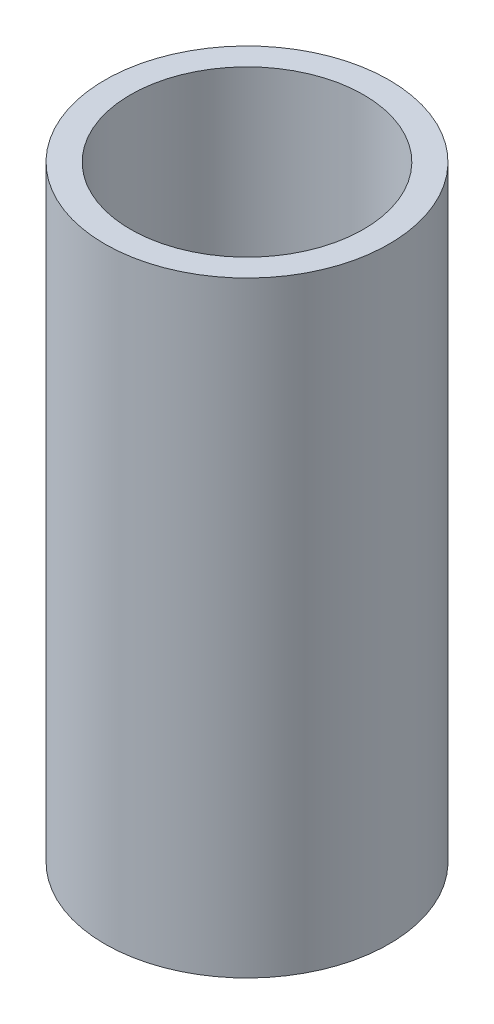
ISO-10303-21;
HEADER;
FILE_DESCRIPTION(('STEP AP214'),'2;1');
FILE_NAME('part.step','',(''),(''),'','','');
FILE_SCHEMA(('AUTOMOTIVE_DESIGN { 1 0 10303 214 1 1 1 1 }'));
ENDSEC;
DATA;
#1=APPLICATION_CONTEXT('core data for automotive mechanical design processes');
#2=APPLICATION_PROTOCOL_DEFINITION('international standard','automotive_design',2000,#1);
#3=PRODUCT_CONTEXT('',#1,'mechanical');
#4=PRODUCT('Part','Part','',(#3));
#5=PRODUCT_RELATED_PRODUCT_CATEGORY('part','',(#4));
#6=PRODUCT_DEFINITION_FORMATION('','',#4);
#7=PRODUCT_DEFINITION_CONTEXT('part definition',#1,'design');
#8=PRODUCT_DEFINITION('design','',#6,#7);
#9=PRODUCT_DEFINITION_SHAPE('','',#8);
#10=(LENGTH_UNIT() NAMED_UNIT(*) SI_UNIT(.MILLI.,.METRE.));
#11=(NAMED_UNIT(*) PLANE_ANGLE_UNIT() SI_UNIT($,.RADIAN.));
#12=(NAMED_UNIT(*) SI_UNIT($,.STERADIAN.) SOLID_ANGLE_UNIT());
#13=UNCERTAINTY_MEASURE_WITH_UNIT(LENGTH_MEASURE(1.E-05),#10,'distance_accuracy_value','');
#14=(GEOMETRIC_REPRESENTATION_CONTEXT(3) GLOBAL_UNCERTAINTY_ASSIGNED_CONTEXT((#13)) GLOBAL_UNIT_ASSIGNED_CONTEXT((#10,
#11,#12)) REPRESENTATION_CONTEXT('',''));
#15=CARTESIAN_POINT('',(0.,0.,0.));
#16=DIRECTION('',(0.,0.,1.));
#17=DIRECTION('',(1.,0.,0.));
#18=AXIS2_PLACEMENT_3D('',#15,#16,#17);
#19=CARTESIAN_POINT('',(0.,6.5,0.));
#20=DIRECTION('',(0.,1.,0.));
#21=DIRECTION('',(0.,0.,1.));
#22=AXIS2_PLACEMENT_3D('',#19,#20,#21);
#23=PLANE('',#22);
#24=CARTESIAN_POINT('',(0.,6.5,0.));
#25=DIRECTION('',(0.,1.,0.));
#26=DIRECTION('',(0.,0.,1.));
#27=AXIS2_PLACEMENT_3D('',#24,#25,#26);
#28=CIRCLE('',#27,3.048);
#29=CARTESIAN_POINT('',(0.,6.5,-3.048));
#30=VERTEX_POINT('',#29);
#31=EDGE_CURVE('E10',#30,#30,#28,.T.);
#32=ORIENTED_EDGE('',*,*,#31,.T.);
#33=EDGE_LOOP('',(#32));
#34=FACE_BOUND('',#33,.T.);
#35=CARTESIAN_POINT('',(0.,6.5,0.));
#36=DIRECTION('',(0.,1.,0.));
#37=DIRECTION('',(0.,0.,1.));
#38=AXIS2_PLACEMENT_3D('',#35,#36,#37);
#39=CIRCLE('',#38,2.5);
#40=CARTESIAN_POINT('',(0.,6.5,-2.5));
#41=VERTEX_POINT('',#40);
#42=EDGE_CURVE('E46',#41,#41,#39,.T.);
#43=ORIENTED_EDGE('',*,*,#42,.F.);
#44=EDGE_LOOP('',(#43));
#45=FACE_BOUND('',#44,.T.);
#46=ADVANCED_FACE('F35',(#34,#45),#23,.T.);
#47=CARTESIAN_POINT('',(0.,-6.5,0.));
#48=DIRECTION('',(0.,1.,0.));
#49=DIRECTION('',(0.,0.,1.));
#50=AXIS2_PLACEMENT_3D('',#47,#48,#49);
#51=PLANE('',#50);
#52=CARTESIAN_POINT('',(0.,-6.5,0.));
#53=DIRECTION('',(0.,1.,0.));
#54=DIRECTION('',(0.,0.,1.));
#55=AXIS2_PLACEMENT_3D('',#52,#53,#54);
#56=CIRCLE('',#55,3.048);
#57=CARTESIAN_POINT('',(0.,-6.5,-3.048));
#58=VERTEX_POINT('',#57);
#59=EDGE_CURVE('E39',#58,#58,#56,.T.);
#60=ORIENTED_EDGE('',*,*,#59,.F.);
#61=EDGE_LOOP('',(#60));
#62=FACE_BOUND('',#61,.T.);
#63=CARTESIAN_POINT('',(0.,-6.5,0.));
#64=DIRECTION('',(0.,1.,0.));
#65=DIRECTION('',(0.,0.,1.));
#66=AXIS2_PLACEMENT_3D('',#63,#64,#65);
#67=CIRCLE('',#66,2.5);
#68=CARTESIAN_POINT('',(0.,-6.5,-2.5));
#69=VERTEX_POINT('',#68);
#70=EDGE_CURVE('E48',#69,#69,#67,.T.);
#71=ORIENTED_EDGE('',*,*,#70,.T.);
#72=EDGE_LOOP('',(#71));
#73=FACE_BOUND('',#72,.T.);
#74=ADVANCED_FACE('F58',(#62,#73),#51,.F.);
#75=CARTESIAN_POINT('',(0.,6.5,0.));
#76=DIRECTION('',(0.,-1.,0.));
#77=DIRECTION('',(0.,0.,-1.));
#78=AXIS2_PLACEMENT_3D('',#75,#76,#77);
#79=CYLINDRICAL_SURFACE('',#78,3.048);
#80=CARTESIAN_POINT('',(0.,6.5,-3.048));
#81=CARTESIAN_POINT('',(0.,6.36458333333333,-3.048));
#82=CARTESIAN_POINT('',(0.,6.22916666666667,-3.048));
#83=CARTESIAN_POINT('',(0.,5.95833333333333,-3.048));
#84=CARTESIAN_POINT('',(0.,5.82291666666667,-3.048));
#85=CARTESIAN_POINT('',(0.,5.55208333333333,-3.048));
#86=CARTESIAN_POINT('',(0.,5.41666666666667,-3.048));
#87=CARTESIAN_POINT('',(0.,5.14583333333333,-3.048));
#88=CARTESIAN_POINT('',(0.,5.01041666666667,-3.048));
#89=CARTESIAN_POINT('',(0.,4.73958333333333,-3.048));
#90=CARTESIAN_POINT('',(0.,4.60416666666667,-3.048));
#91=CARTESIAN_POINT('',(0.,4.33333333333333,-3.048));
#92=CARTESIAN_POINT('',(0.,4.19791666666667,-3.048));
#93=CARTESIAN_POINT('',(0.,3.92708333333333,-3.048));
#94=CARTESIAN_POINT('',(0.,3.79166666666667,-3.048));
#95=CARTESIAN_POINT('',(0.,3.52083333333333,-3.048));
#96=CARTESIAN_POINT('',(0.,3.38541666666667,-3.048));
#97=CARTESIAN_POINT('',(0.,3.11458333333333,-3.048));
#98=CARTESIAN_POINT('',(0.,2.97916666666667,-3.048));
#99=CARTESIAN_POINT('',(0.,2.70833333333333,-3.048));
#100=CARTESIAN_POINT('',(0.,2.57291666666667,-3.048));
#101=CARTESIAN_POINT('',(0.,2.30208333333333,-3.048));
#102=CARTESIAN_POINT('',(0.,2.16666666666667,-3.048));
#103=CARTESIAN_POINT('',(0.,1.89583333333333,-3.048));
#104=CARTESIAN_POINT('',(0.,1.76041666666667,-3.048));
#105=CARTESIAN_POINT('',(0.,1.48958333333333,-3.048));
#106=CARTESIAN_POINT('',(0.,1.35416666666667,-3.048));
#107=CARTESIAN_POINT('',(0.,1.08333333333333,-3.048));
#108=CARTESIAN_POINT('',(0.,0.947916666666667,-3.048));
#109=CARTESIAN_POINT('',(0.,0.677083333333333,-3.048));
#110=CARTESIAN_POINT('',(0.,0.541666666666667,-3.048));
#111=CARTESIAN_POINT('',(0.,0.270833333333334,-3.048));
#112=CARTESIAN_POINT('',(0.,0.135416666666667,-3.048));
#113=CARTESIAN_POINT('',(0.,-0.135416666666667,-3.048));
#114=CARTESIAN_POINT('',(0.,-0.270833333333334,-3.048));
#115=CARTESIAN_POINT('',(0.,-0.541666666666667,-3.048));
#116=CARTESIAN_POINT('',(0.,-0.677083333333333,-3.048));
#117=CARTESIAN_POINT('',(0.,-0.947916666666667,-3.048));
#118=CARTESIAN_POINT('',(0.,-1.08333333333333,-3.048));
#119=CARTESIAN_POINT('',(0.,-1.35416666666667,-3.048));
#120=CARTESIAN_POINT('',(0.,-1.48958333333333,-3.048));
#121=CARTESIAN_POINT('',(0.,-1.76041666666667,-3.048));
#122=CARTESIAN_POINT('',(0.,-1.89583333333333,-3.048));
#123=CARTESIAN_POINT('',(0.,-2.16666666666667,-3.048));
#124=CARTESIAN_POINT('',(0.,-2.30208333333333,-3.048));
#125=CARTESIAN_POINT('',(0.,-2.57291666666667,-3.048));
#126=CARTESIAN_POINT('',(0.,-2.70833333333333,-3.048));
#127=CARTESIAN_POINT('',(0.,-2.97916666666667,-3.048));
#128=CARTESIAN_POINT('',(0.,-3.11458333333333,-3.048));
#129=CARTESIAN_POINT('',(0.,-3.38541666666667,-3.048));
#130=CARTESIAN_POINT('',(0.,-3.52083333333333,-3.048));
#131=CARTESIAN_POINT('',(0.,-3.79166666666667,-3.048));
#132=CARTESIAN_POINT('',(0.,-3.92708333333333,-3.048));
#133=CARTESIAN_POINT('',(0.,-4.19791666666667,-3.048));
#134=CARTESIAN_POINT('',(0.,-4.33333333333333,-3.048));
#135=CARTESIAN_POINT('',(0.,-4.60416666666667,-3.048));
#136=CARTESIAN_POINT('',(0.,-4.73958333333333,-3.048));
#137=CARTESIAN_POINT('',(0.,-5.01041666666667,-3.048));
#138=CARTESIAN_POINT('',(0.,-5.14583333333333,-3.048));
#139=CARTESIAN_POINT('',(0.,-5.41666666666667,-3.048));
#140=CARTESIAN_POINT('',(0.,-5.55208333333333,-3.048));
#141=CARTESIAN_POINT('',(0.,-5.82291666666667,-3.048));
#142=CARTESIAN_POINT('',(0.,-5.95833333333333,-3.048));
#143=CARTESIAN_POINT('',(0.,-6.22916666666667,-3.048));
#144=CARTESIAN_POINT('',(0.,-6.36458333333333,-3.048));
#145=CARTESIAN_POINT('',(0.,-6.5,-3.048));
#146=B_SPLINE_CURVE_WITH_KNOTS('',3,(#80,#81,#82,#83,#84,#85,#86,#87,#88,#89,#90,#91,#92,#93,
#94,#95,#96,#97,#98,#99,#100,#101,#102,#103,#104,#105,#106,#107,#108,#109,#110,#111,#112,#113,
#114,#115,#116,#117,#118,#119,#120,#121,#122,#123,#124,#125,#126,#127,#128,#129,#130,#131,#132,
#133,#134,#135,#136,#137,#138,#139,#140,#141,#142,#143,#144,#145),.UNSPECIFIED.,.F.,.F.,(4,2,2,
2,2,2,2,2,2,2,2,2,2,2,2,2,2,2,2,2,2,2,2,2,2,2,2,2,2,2,2,2,4),(0.,0.40625,0.812500000000001,
1.21875,1.625,2.03125,2.4375,2.84375,3.25,3.65625,4.0625,4.46875,4.875,5.28125,5.6875,6.09375,
6.5,6.90625,7.3125,7.71875,8.125,8.53125,8.9375,9.34375,9.75,10.15625,10.5625,10.96875,11.375,
11.78125,12.1875,12.59375,13.),.UNSPECIFIED.);
#147=EDGE_CURVE('BSEAM37',#30,#58,#146,.T.);
#148=ORIENTED_EDGE('',*,*,#31,.F.);
#149=ORIENTED_EDGE('',*,*,#59,.T.);
#150=ORIENTED_EDGE('',*,*,#147,.T.);
#151=ORIENTED_EDGE('',*,*,#147,.F.);
#152=EDGE_LOOP('',(#148,#150,#149,#151));
#153=FACE_BOUND('',#152,.T.);
#154=ADVANCED_FACE('F37',(#153),#79,.T.);
#155=CARTESIAN_POINT('',(0.,6.5,0.));
#156=DIRECTION('',(0.,-1.,0.));
#157=DIRECTION('',(0.,0.,-1.));
#158=AXIS2_PLACEMENT_3D('',#155,#156,#157);
#159=CYLINDRICAL_SURFACE('',#158,2.5);
#160=CARTESIAN_POINT('',(0.,6.5,-2.5));
#161=CARTESIAN_POINT('',(0.,6.36458333333333,-2.5));
#162=CARTESIAN_POINT('',(0.,6.22916666666667,-2.5));
#163=CARTESIAN_POINT('',(0.,5.95833333333333,-2.5));
#164=CARTESIAN_POINT('',(0.,5.82291666666667,-2.5));
#165=CARTESIAN_POINT('',(0.,5.55208333333333,-2.5));
#166=CARTESIAN_POINT('',(0.,5.41666666666667,-2.5));
#167=CARTESIAN_POINT('',(0.,5.14583333333333,-2.5));
#168=CARTESIAN_POINT('',(0.,5.01041666666667,-2.5));
#169=CARTESIAN_POINT('',(0.,4.73958333333333,-2.5));
#170=CARTESIAN_POINT('',(0.,4.60416666666667,-2.5));
#171=CARTESIAN_POINT('',(0.,4.33333333333333,-2.5));
#172=CARTESIAN_POINT('',(0.,4.19791666666667,-2.5));
#173=CARTESIAN_POINT('',(0.,3.92708333333333,-2.5));
#174=CARTESIAN_POINT('',(0.,3.79166666666667,-2.5));
#175=CARTESIAN_POINT('',(0.,3.52083333333333,-2.5));
#176=CARTESIAN_POINT('',(0.,3.38541666666667,-2.5));
#177=CARTESIAN_POINT('',(0.,3.11458333333333,-2.5));
#178=CARTESIAN_POINT('',(0.,2.97916666666667,-2.5));
#179=CARTESIAN_POINT('',(0.,2.70833333333333,-2.5));
#180=CARTESIAN_POINT('',(0.,2.57291666666667,-2.5));
#181=CARTESIAN_POINT('',(0.,2.30208333333333,-2.5));
#182=CARTESIAN_POINT('',(0.,2.16666666666667,-2.5));
#183=CARTESIAN_POINT('',(0.,1.89583333333333,-2.5));
#184=CARTESIAN_POINT('',(0.,1.76041666666667,-2.5));
#185=CARTESIAN_POINT('',(0.,1.48958333333333,-2.5));
#186=CARTESIAN_POINT('',(0.,1.35416666666667,-2.5));
#187=CARTESIAN_POINT('',(0.,1.08333333333333,-2.5));
#188=CARTESIAN_POINT('',(0.,0.947916666666666,-2.5));
#189=CARTESIAN_POINT('',(0.,0.677083333333332,-2.5));
#190=CARTESIAN_POINT('',(0.,0.541666666666666,-2.5));
#191=CARTESIAN_POINT('',(0.,0.270833333333333,-2.5));
#192=CARTESIAN_POINT('',(0.,0.135416666666666,-2.5));
#193=CARTESIAN_POINT('',(0.,-0.135416666666668,-2.5));
#194=CARTESIAN_POINT('',(0.,-0.270833333333334,-2.5));
#195=CARTESIAN_POINT('',(0.,-0.541666666666668,-2.5));
#196=CARTESIAN_POINT('',(0.,-0.677083333333334,-2.5));
#197=CARTESIAN_POINT('',(0.,-0.947916666666667,-2.5));
#198=CARTESIAN_POINT('',(0.,-1.08333333333333,-2.5));
#199=CARTESIAN_POINT('',(0.,-1.35416666666667,-2.5));
#200=CARTESIAN_POINT('',(0.,-1.48958333333333,-2.5));
#201=CARTESIAN_POINT('',(0.,-1.76041666666667,-2.5));
#202=CARTESIAN_POINT('',(0.,-1.89583333333333,-2.5));
#203=CARTESIAN_POINT('',(0.,-2.16666666666667,-2.5));
#204=CARTESIAN_POINT('',(0.,-2.30208333333333,-2.5));
#205=CARTESIAN_POINT('',(0.,-2.57291666666667,-2.5));
#206=CARTESIAN_POINT('',(0.,-2.70833333333333,-2.5));
#207=CARTESIAN_POINT('',(0.,-2.97916666666667,-2.5));
#208=CARTESIAN_POINT('',(0.,-3.11458333333333,-2.5));
#209=CARTESIAN_POINT('',(0.,-3.38541666666667,-2.5));
#210=CARTESIAN_POINT('',(0.,-3.52083333333333,-2.5));
#211=CARTESIAN_POINT('',(0.,-3.79166666666667,-2.5));
#212=CARTESIAN_POINT('',(0.,-3.92708333333333,-2.5));
#213=CARTESIAN_POINT('',(0.,-4.19791666666667,-2.5));
#214=CARTESIAN_POINT('',(0.,-4.33333333333333,-2.5));
#215=CARTESIAN_POINT('',(0.,-4.60416666666667,-2.5));
#216=CARTESIAN_POINT('',(0.,-4.73958333333333,-2.5));
#217=CARTESIAN_POINT('',(0.,-5.01041666666667,-2.5));
#218=CARTESIAN_POINT('',(0.,-5.14583333333333,-2.5));
#219=CARTESIAN_POINT('',(0.,-5.41666666666667,-2.5));
#220=CARTESIAN_POINT('',(0.,-5.55208333333333,-2.5));
#221=CARTESIAN_POINT('',(0.,-5.82291666666667,-2.5));
#222=CARTESIAN_POINT('',(0.,-5.95833333333333,-2.5));
#223=CARTESIAN_POINT('',(0.,-6.22916666666667,-2.5));
#224=CARTESIAN_POINT('',(0.,-6.36458333333333,-2.5));
#225=CARTESIAN_POINT('',(0.,-6.5,-2.5));
#226=B_SPLINE_CURVE_WITH_KNOTS('',3,(#160,#161,#162,#163,#164,#165,#166,#167,#168,#169,#170,
#171,#172,#173,#174,#175,#176,#177,#178,#179,#180,#181,#182,#183,#184,#185,#186,#187,#188,#189,
#190,#191,#192,#193,#194,#195,#196,#197,#198,#199,#200,#201,#202,#203,#204,#205,#206,#207,#208,
#209,#210,#211,#212,#213,#214,#215,#216,#217,#218,#219,#220,#221,#222,#223,#224,#225),
.UNSPECIFIED.,.F.,.F.,(4,2,2,2,2,2,2,2,2,2,2,2,2,2,2,2,2,2,2,2,2,2,2,2,2,2,2,2,2,2,2,2,4),(0.,
0.40625,0.8125,1.21875,1.625,2.03125,2.4375,2.84375,3.25,3.65625,4.0625,4.46875,4.875,5.28125,
5.6875,6.09375,6.5,6.90625,7.3125,7.71875,8.125,8.53125,8.9375,9.34375,9.75,10.15625,10.5625,
10.96875,11.375,11.78125,12.1875,12.59375,13.),.UNSPECIFIED.);
#227=EDGE_CURVE('BSEAM54',#41,#69,#226,.T.);
#228=ORIENTED_EDGE('',*,*,#42,.T.);
#229=ORIENTED_EDGE('',*,*,#70,.F.);
#230=ORIENTED_EDGE('',*,*,#227,.T.);
#231=ORIENTED_EDGE('',*,*,#227,.F.);
#232=EDGE_LOOP('',(#228,#230,#229,#231));
#233=FACE_BOUND('',#232,.T.);
#234=ADVANCED_FACE('F54',(#233),#159,.F.);
#235=CLOSED_SHELL('',(#46,#74,#154,#234));
#236=MANIFOLD_SOLID_BREP('B2',#235);
#237=ADVANCED_BREP_SHAPE_REPRESENTATION('',(#18,#236),#14);
#238=SHAPE_DEFINITION_REPRESENTATION(#9,#237);
ENDSEC;
END-ISO-10303-21;
